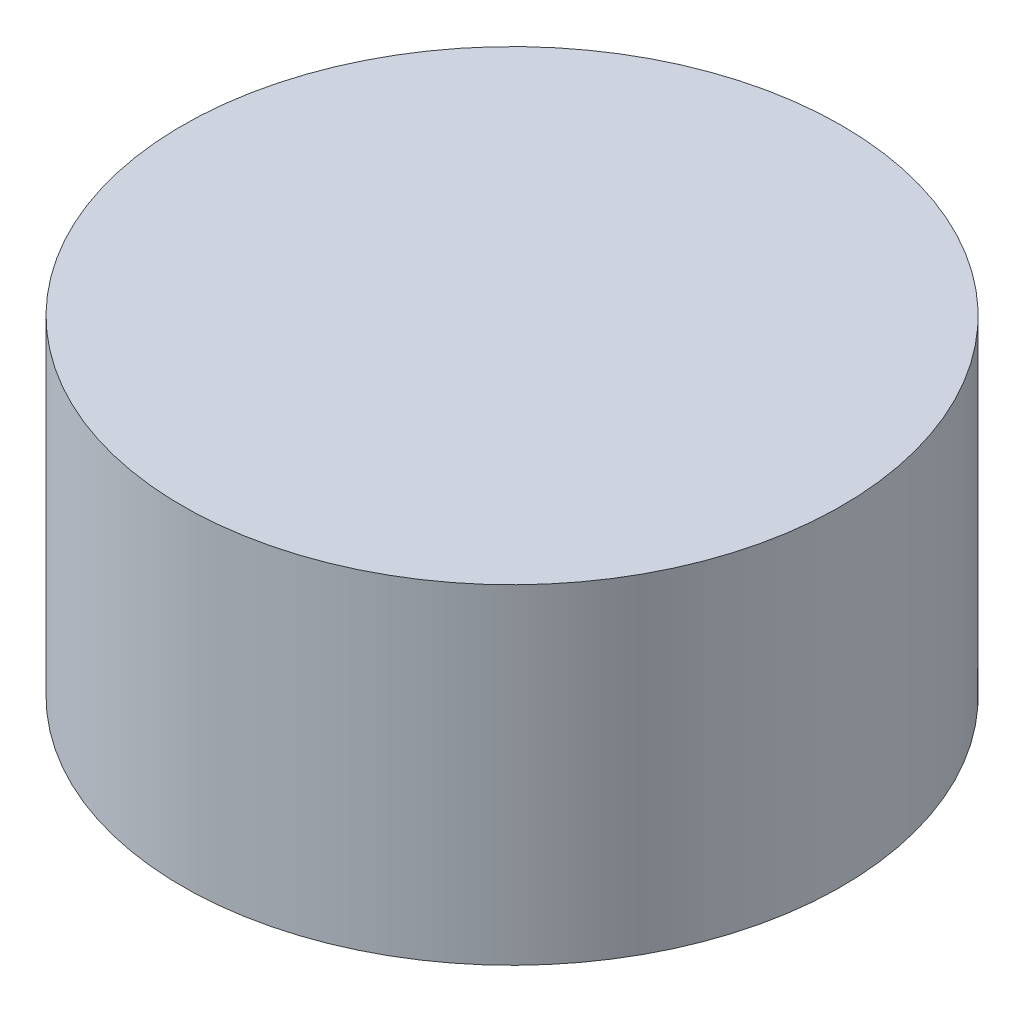
ISO-10303-21;
HEADER;
FILE_DESCRIPTION(('STEP AP214'),'2;1');
FILE_NAME('part.step','',(''),(''),'','','');
FILE_SCHEMA(('AUTOMOTIVE_DESIGN { 1 0 10303 214 1 1 1 1 }'));
ENDSEC;
DATA;
#1=APPLICATION_CONTEXT('core data for automotive mechanical design processes');
#2=APPLICATION_PROTOCOL_DEFINITION('international standard','automotive_design',2000,#1);
#3=PRODUCT_CONTEXT('',#1,'mechanical');
#4=PRODUCT('Part','Part','',(#3));
#5=PRODUCT_RELATED_PRODUCT_CATEGORY('part','',(#4));
#6=PRODUCT_DEFINITION_FORMATION('','',#4);
#7=PRODUCT_DEFINITION_CONTEXT('part definition',#1,'design');
#8=PRODUCT_DEFINITION('design','',#6,#7);
#9=PRODUCT_DEFINITION_SHAPE('','',#8);
#10=(LENGTH_UNIT() NAMED_UNIT(*) SI_UNIT(.MILLI.,.METRE.));
#11=(NAMED_UNIT(*) PLANE_ANGLE_UNIT() SI_UNIT($,.RADIAN.));
#12=(NAMED_UNIT(*) SI_UNIT($,.STERADIAN.) SOLID_ANGLE_UNIT());
#13=UNCERTAINTY_MEASURE_WITH_UNIT(LENGTH_MEASURE(1.E-05),#10,'distance_accuracy_value','');
#14=(GEOMETRIC_REPRESENTATION_CONTEXT(3) GLOBAL_UNCERTAINTY_ASSIGNED_CONTEXT((#13)) GLOBAL_UNIT_ASSIGNED_CONTEXT((#10,
#11,#12)) REPRESENTATION_CONTEXT('',''));
#15=CARTESIAN_POINT('',(0.,0.,0.));
#16=DIRECTION('',(0.,0.,1.));
#17=DIRECTION('',(1.,0.,0.));
#18=AXIS2_PLACEMENT_3D('',#15,#16,#17);
#19=CARTESIAN_POINT('',(-50.,-50.,0.));
#20=DIRECTION('',(0.,1.,0.));
#21=DIRECTION('',(0.,0.,1.));
#22=AXIS2_PLACEMENT_3D('',#19,#20,#21);
#23=PLANE('',#22);
#24=CARTESIAN_POINT('',(50.,-50.,0.));
#25=DIRECTION('',(0.,-1.,0.));
#26=DIRECTION('',(0.,0.,-1.));
#27=AXIS2_PLACEMENT_3D('',#24,#25,#26);
#28=CIRCLE('',#27,100.);
#29=CARTESIAN_POINT('',(50.,-50.,-100.));
#30=VERTEX_POINT('',#29);
#31=EDGE_CURVE('E10',#30,#30,#28,.T.);
#32=ORIENTED_EDGE('',*,*,#31,.T.);
#33=EDGE_LOOP('',(#32));
#34=FACE_BOUND('',#33,.T.);
#35=ADVANCED_FACE('F39',(#34),#23,.F.);
#36=CARTESIAN_POINT('',(50.,-50.,0.));
#37=DIRECTION('',(0.,-1.,0.));
#38=DIRECTION('',(0.,0.,-1.));
#39=AXIS2_PLACEMENT_3D('',#36,#37,#38);
#40=CYLINDRICAL_SURFACE('',#39,100.);
#41=ORIENTED_EDGE('',*,*,#31,.F.);
#42=EDGE_LOOP('',(#41));
#43=FACE_BOUND('',#42,.T.);
#44=CARTESIAN_POINT('',(50.,50.,0.));
#45=DIRECTION('',(0.,-1.,0.));
#46=DIRECTION('',(0.,0.,-1.));
#47=AXIS2_PLACEMENT_3D('',#44,#45,#46);
#48=CIRCLE('',#47,100.);
#49=CARTESIAN_POINT('',(50.,50.,-100.));
#50=VERTEX_POINT('',#49);
#51=EDGE_CURVE('E46',#50,#50,#48,.T.);
#52=ORIENTED_EDGE('',*,*,#51,.T.);
#53=EDGE_LOOP('',(#52));
#54=FACE_BOUND('',#53,.T.);
#55=ADVANCED_FACE('F53',(#43,#54),#40,.T.);
#56=CARTESIAN_POINT('',(-50.,50.,0.));
#57=DIRECTION('',(0.,-1.,0.));
#58=DIRECTION('',(0.,0.,-1.));
#59=AXIS2_PLACEMENT_3D('',#56,#57,#58);
#60=PLANE('',#59);
#61=ORIENTED_EDGE('',*,*,#51,.F.);
#62=EDGE_LOOP('',(#61));
#63=FACE_BOUND('',#62,.T.);
#64=ADVANCED_FACE('F55',(#63),#60,.F.);
#65=CLOSED_SHELL('',(#35,#55,#64));
#66=MANIFOLD_SOLID_BREP('B2',#65);
#67=ADVANCED_BREP_SHAPE_REPRESENTATION('',(#18,#66),#14);
#68=SHAPE_DEFINITION_REPRESENTATION(#9,#67);
ENDSEC;
END-ISO-10303-21;
